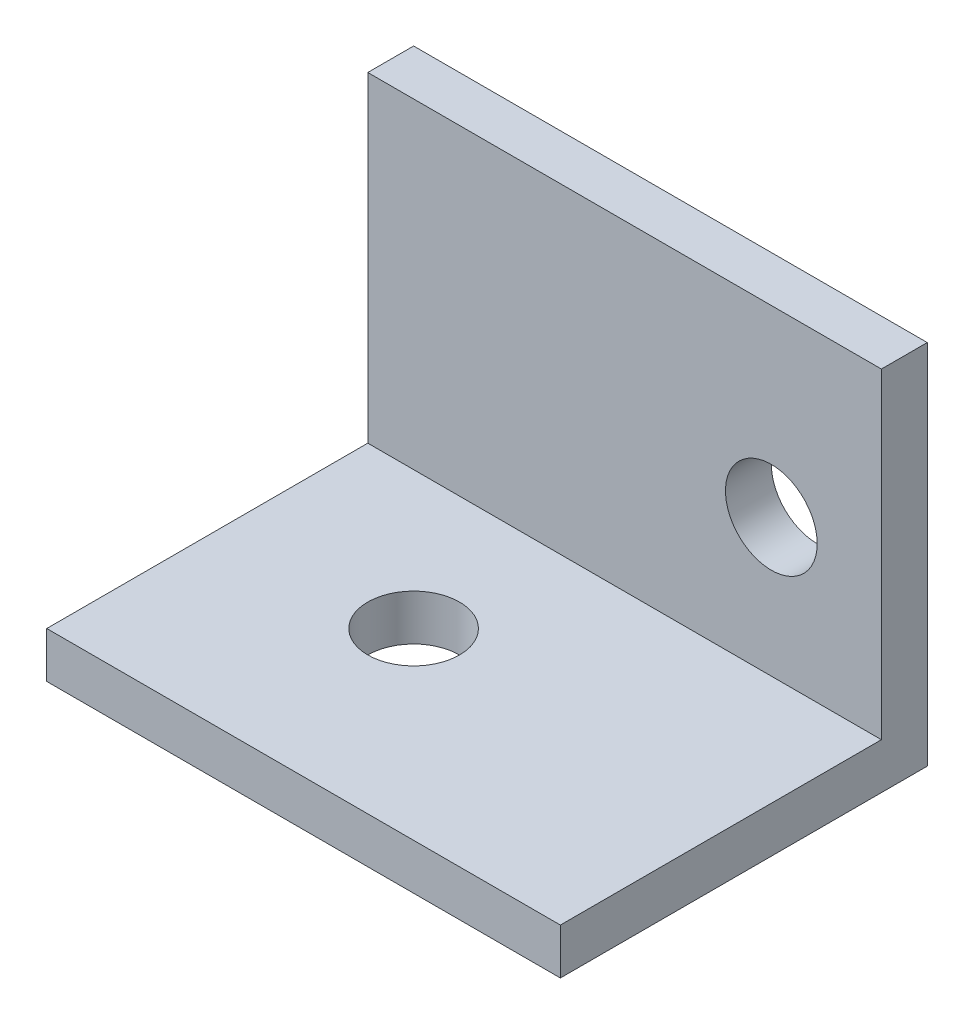
ISO-10303-21;
HEADER;
FILE_DESCRIPTION(('STEP AP214'),'2;1');
FILE_NAME('part.step','',(''),(''),'','','');
FILE_SCHEMA(('AUTOMOTIVE_DESIGN { 1 0 10303 214 1 1 1 1 }'));
ENDSEC;
DATA;
#1=APPLICATION_CONTEXT('core data for automotive mechanical design processes');
#2=APPLICATION_PROTOCOL_DEFINITION('international standard','automotive_design',2000,#1);
#3=PRODUCT_CONTEXT('',#1,'mechanical');
#4=PRODUCT('Part','Part','',(#3));
#5=PRODUCT_RELATED_PRODUCT_CATEGORY('part','',(#4));
#6=PRODUCT_DEFINITION_FORMATION('','',#4);
#7=PRODUCT_DEFINITION_CONTEXT('part definition',#1,'design');
#8=PRODUCT_DEFINITION('design','',#6,#7);
#9=PRODUCT_DEFINITION_SHAPE('','',#8);
#10=(LENGTH_UNIT() NAMED_UNIT(*) SI_UNIT(.MILLI.,.METRE.));
#11=(NAMED_UNIT(*) PLANE_ANGLE_UNIT() SI_UNIT($,.RADIAN.));
#12=(NAMED_UNIT(*) SI_UNIT($,.STERADIAN.) SOLID_ANGLE_UNIT());
#13=UNCERTAINTY_MEASURE_WITH_UNIT(LENGTH_MEASURE(1.E-05),#10,'distance_accuracy_value','');
#14=(GEOMETRIC_REPRESENTATION_CONTEXT(3) GLOBAL_UNCERTAINTY_ASSIGNED_CONTEXT((#13)) GLOBAL_UNIT_ASSIGNED_CONTEXT((#10,
#11,#12)) REPRESENTATION_CONTEXT('',''));
#15=CARTESIAN_POINT('',(0.,0.,0.));
#16=DIRECTION('',(0.,0.,1.));
#17=DIRECTION('',(1.,0.,0.));
#18=AXIS2_PLACEMENT_3D('',#15,#16,#17);
#19=CARTESIAN_POINT('',(0.,3.175,0.));
#20=DIRECTION('',(0.,-1.,0.));
#21=DIRECTION('',(0.,0.,-1.));
#22=AXIS2_PLACEMENT_3D('',#19,#20,#21);
#23=PLANE('',#22);
#24=CARTESIAN_POINT('',(-5.08,3.175,0.));
#25=DIRECTION('',(0.,1.,0.));
#26=DIRECTION('',(0.,0.,1.));
#27=AXIS2_PLACEMENT_3D('',#24,#25,#26);
#28=CIRCLE('',#27,3.175);
#29=CARTESIAN_POINT('',(-5.08,3.175,3.175));
#30=VERTEX_POINT('',#29);
#31=EDGE_CURVE('E150',#30,#30,#28,.T.);
#32=ORIENTED_EDGE('',*,*,#31,.F.);
#33=EDGE_LOOP('',(#32));
#34=FACE_BOUND('',#33,.T.);
#35=DIRECTION('',(1.,0.,0.));
#36=VECTOR('',#35,1.);
#37=CARTESIAN_POINT('',(-17.78,3.175,-9.525));
#38=LINE('',#37,#36);
#39=CARTESIAN_POINT('',(-17.78,3.175,-9.525));
#40=VERTEX_POINT('',#39);
#41=CARTESIAN_POINT('',(17.78,3.175,-9.525));
#42=VERTEX_POINT('',#41);
#43=EDGE_CURVE('E54',#40,#42,#38,.T.);
#44=ORIENTED_EDGE('',*,*,#43,.F.);
#45=DIRECTION('',(0.,0.,1.));
#46=VECTOR('',#45,1.);
#47=CARTESIAN_POINT('',(-17.78,3.175,12.7));
#48=LINE('',#47,#46);
#49=CARTESIAN_POINT('',(-17.78,3.175,12.7));
#50=VERTEX_POINT('',#49);
#51=EDGE_CURVE('E140',#40,#50,#48,.T.);
#52=ORIENTED_EDGE('',*,*,#51,.T.);
#53=DIRECTION('',(1.,0.,0.));
#54=VECTOR('',#53,1.);
#55=CARTESIAN_POINT('',(-17.78,3.175,12.7));
#56=LINE('',#55,#54);
#57=CARTESIAN_POINT('',(17.78,3.175,12.7));
#58=VERTEX_POINT('',#57);
#59=EDGE_CURVE('E60',#50,#58,#56,.T.);
#60=ORIENTED_EDGE('',*,*,#59,.T.);
#61=DIRECTION('',(0.,0.,-1.));
#62=VECTOR('',#61,1.);
#63=CARTESIAN_POINT('',(17.78,3.175,12.7));
#64=LINE('',#63,#62);
#65=EDGE_CURVE('E89',#58,#42,#64,.T.);
#66=ORIENTED_EDGE('',*,*,#65,.T.);
#67=EDGE_LOOP('',(#44,#52,#60,#66));
#68=FACE_BOUND('',#67,.T.);
#69=ADVANCED_FACE('F39',(#34,#68),#23,.F.);
#70=CARTESIAN_POINT('',(17.78,3.175,12.7));
#71=DIRECTION('',(-1.,0.,0.));
#72=DIRECTION('',(0.,0.,1.));
#73=AXIS2_PLACEMENT_3D('',#70,#71,#72);
#74=PLANE('',#73);
#75=DIRECTION('',(0.,0.,-1.));
#76=VECTOR('',#75,1.);
#77=CARTESIAN_POINT('',(17.78,0.,12.7));
#78=LINE('',#77,#76);
#79=CARTESIAN_POINT('',(17.78,0.,12.7));
#80=VERTEX_POINT('',#79);
#81=CARTESIAN_POINT('',(17.78,0.,-12.7));
#82=VERTEX_POINT('',#81);
#83=EDGE_CURVE('E95',#80,#82,#78,.T.);
#84=ORIENTED_EDGE('',*,*,#83,.T.);
#85=DIRECTION('',(0.,-1.,0.));
#86=VECTOR('',#85,1.);
#87=CARTESIAN_POINT('',(17.78,3.175,-12.7));
#88=LINE('',#87,#86);
#89=CARTESIAN_POINT('',(17.78,25.4,-12.7));
#90=VERTEX_POINT('',#89);
#91=EDGE_CURVE('E11',#90,#82,#88,.T.);
#92=ORIENTED_EDGE('',*,*,#91,.F.);
#93=DIRECTION('',(0.,0.,-1.));
#94=VECTOR('',#93,1.);
#95=CARTESIAN_POINT('',(17.78,25.4,-12.7));
#96=LINE('',#95,#94);
#97=CARTESIAN_POINT('',(17.78,25.4,-9.525));
#98=VERTEX_POINT('',#97);
#99=EDGE_CURVE('E131',#98,#90,#96,.T.);
#100=ORIENTED_EDGE('',*,*,#99,.F.);
#101=DIRECTION('',(0.,-1.,0.));
#102=VECTOR('',#101,1.);
#103=CARTESIAN_POINT('',(17.78,25.4,-9.525));
#104=LINE('',#103,#102);
#105=EDGE_CURVE('E104',#98,#42,#104,.T.);
#106=ORIENTED_EDGE('',*,*,#105,.T.);
#107=ORIENTED_EDGE('',*,*,#65,.F.);
#108=DIRECTION('',(0.,-1.,0.));
#109=VECTOR('',#108,1.);
#110=CARTESIAN_POINT('',(17.78,3.175,12.7));
#111=LINE('',#110,#109);
#112=EDGE_CURVE('E82',#58,#80,#111,.T.);
#113=ORIENTED_EDGE('',*,*,#112,.T.);
#114=EDGE_LOOP('',(#84,#92,#100,#106,#107,#113));
#115=FACE_BOUND('',#114,.T.);
#116=ADVANCED_FACE('F41',(#115),#74,.F.);
#117=CARTESIAN_POINT('',(-17.78,3.175,-12.7));
#118=DIRECTION('',(0.,0.,1.));
#119=DIRECTION('',(1.,0.,0.));
#120=AXIS2_PLACEMENT_3D('',#117,#118,#119);
#121=PLANE('',#120);
#122=CARTESIAN_POINT('',(10.16,12.7,-12.7));
#123=DIRECTION('',(0.,0.,1.));
#124=DIRECTION('',(1.,0.,0.));
#125=AXIS2_PLACEMENT_3D('',#122,#123,#124);
#126=CIRCLE('',#125,3.175);
#127=CARTESIAN_POINT('',(13.335,12.7,-12.7));
#128=VERTEX_POINT('',#127);
#129=EDGE_CURVE('E153',#128,#128,#126,.T.);
#130=ORIENTED_EDGE('',*,*,#129,.T.);
#131=EDGE_LOOP('',(#130));
#132=FACE_BOUND('',#131,.T.);
#133=DIRECTION('',(-1.,0.,0.));
#134=VECTOR('',#133,1.);
#135=CARTESIAN_POINT('',(-17.78,0.,-12.7));
#136=LINE('',#135,#134);
#137=CARTESIAN_POINT('',(-17.78,0.,-12.7));
#138=VERTEX_POINT('',#137);
#139=EDGE_CURVE('E99',#82,#138,#136,.T.);
#140=ORIENTED_EDGE('',*,*,#139,.T.);
#141=DIRECTION('',(0.,-1.,0.));
#142=VECTOR('',#141,1.);
#143=CARTESIAN_POINT('',(-17.78,3.175,-12.7));
#144=LINE('',#143,#142);
#145=CARTESIAN_POINT('',(-17.78,25.4,-12.7));
#146=VERTEX_POINT('',#145);
#147=EDGE_CURVE('E47',#146,#138,#144,.T.);
#148=ORIENTED_EDGE('',*,*,#147,.F.);
#149=DIRECTION('',(-1.,0.,0.));
#150=VECTOR('',#149,1.);
#151=CARTESIAN_POINT('',(-17.78,25.4,-12.7));
#152=LINE('',#151,#150);
#153=EDGE_CURVE('E123',#90,#146,#152,.T.);
#154=ORIENTED_EDGE('',*,*,#153,.F.);
#155=ORIENTED_EDGE('',*,*,#91,.T.);
#156=EDGE_LOOP('',(#140,#148,#154,#155));
#157=FACE_BOUND('',#156,.T.);
#158=ADVANCED_FACE('F121',(#132,#157),#121,.F.);
#159=CARTESIAN_POINT('',(-17.78,3.175,12.7));
#160=DIRECTION('',(1.,0.,0.));
#161=DIRECTION('',(0.,0.,-1.));
#162=AXIS2_PLACEMENT_3D('',#159,#160,#161);
#163=PLANE('',#162);
#164=DIRECTION('',(0.,0.,1.));
#165=VECTOR('',#164,1.);
#166=CARTESIAN_POINT('',(-17.78,0.,12.7));
#167=LINE('',#166,#165);
#168=CARTESIAN_POINT('',(-17.78,0.,12.7));
#169=VERTEX_POINT('',#168);
#170=EDGE_CURVE('E90',#138,#169,#167,.T.);
#171=ORIENTED_EDGE('',*,*,#170,.T.);
#172=DIRECTION('',(0.,-1.,0.));
#173=VECTOR('',#172,1.);
#174=CARTESIAN_POINT('',(-17.78,3.175,12.7));
#175=LINE('',#174,#173);
#176=EDGE_CURVE('E85',#50,#169,#175,.T.);
#177=ORIENTED_EDGE('',*,*,#176,.F.);
#178=ORIENTED_EDGE('',*,*,#51,.F.);
#179=DIRECTION('',(0.,-1.,0.));
#180=VECTOR('',#179,1.);
#181=CARTESIAN_POINT('',(-17.78,25.4,-9.525));
#182=LINE('',#181,#180);
#183=CARTESIAN_POINT('',(-17.78,25.4,-9.525));
#184=VERTEX_POINT('',#183);
#185=EDGE_CURVE('E100',#184,#40,#182,.T.);
#186=ORIENTED_EDGE('',*,*,#185,.F.);
#187=DIRECTION('',(0.,0.,1.));
#188=VECTOR('',#187,1.);
#189=CARTESIAN_POINT('',(-17.78,25.4,-12.7));
#190=LINE('',#189,#188);
#191=EDGE_CURVE('E117',#146,#184,#190,.T.);
#192=ORIENTED_EDGE('',*,*,#191,.F.);
#193=ORIENTED_EDGE('',*,*,#147,.T.);
#194=EDGE_LOOP('',(#171,#177,#178,#186,#192,#193));
#195=FACE_BOUND('',#194,.T.);
#196=ADVANCED_FACE('F114',(#195),#163,.F.);
#197=CARTESIAN_POINT('',(-17.78,3.175,12.7));
#198=DIRECTION('',(0.,0.,-1.));
#199=DIRECTION('',(-1.,0.,0.));
#200=AXIS2_PLACEMENT_3D('',#197,#198,#199);
#201=PLANE('',#200);
#202=DIRECTION('',(1.,0.,0.));
#203=VECTOR('',#202,1.);
#204=CARTESIAN_POINT('',(-17.78,0.,12.7));
#205=LINE('',#204,#203);
#206=EDGE_CURVE('E79',#169,#80,#205,.T.);
#207=ORIENTED_EDGE('',*,*,#206,.T.);
#208=ORIENTED_EDGE('',*,*,#112,.F.);
#209=ORIENTED_EDGE('',*,*,#59,.F.);
#210=ORIENTED_EDGE('',*,*,#176,.T.);
#211=EDGE_LOOP('',(#207,#208,#209,#210));
#212=FACE_BOUND('',#211,.T.);
#213=ADVANCED_FACE('F81',(#212),#201,.F.);
#214=CARTESIAN_POINT('',(0.,0.,0.));
#215=DIRECTION('',(0.,-1.,0.));
#216=DIRECTION('',(0.,0.,-1.));
#217=AXIS2_PLACEMENT_3D('',#214,#215,#216);
#218=PLANE('',#217);
#219=CARTESIAN_POINT('',(-5.08,0.,0.));
#220=DIRECTION('',(0.,1.,0.));
#221=DIRECTION('',(0.,0.,1.));
#222=AXIS2_PLACEMENT_3D('',#219,#220,#221);
#223=CIRCLE('',#222,3.175);
#224=CARTESIAN_POINT('',(-5.08,0.,3.175));
#225=VERTEX_POINT('',#224);
#226=EDGE_CURVE('E138',#225,#225,#223,.T.);
#227=ORIENTED_EDGE('',*,*,#226,.T.);
#228=EDGE_LOOP('',(#227));
#229=FACE_BOUND('',#228,.T.);
#230=ORIENTED_EDGE('',*,*,#83,.F.);
#231=ORIENTED_EDGE('',*,*,#206,.F.);
#232=ORIENTED_EDGE('',*,*,#170,.F.);
#233=ORIENTED_EDGE('',*,*,#139,.F.);
#234=EDGE_LOOP('',(#230,#231,#232,#233));
#235=FACE_BOUND('',#234,.T.);
#236=ADVANCED_FACE('F98',(#229,#235),#218,.T.);
#237=CARTESIAN_POINT('',(-17.78,25.4,-9.525));
#238=DIRECTION('',(0.,0.,-1.));
#239=DIRECTION('',(-1.,0.,0.));
#240=AXIS2_PLACEMENT_3D('',#237,#238,#239);
#241=PLANE('',#240);
#242=CARTESIAN_POINT('',(10.16,12.7,-9.525));
#243=DIRECTION('',(0.,0.,1.));
#244=DIRECTION('',(1.,0.,0.));
#245=AXIS2_PLACEMENT_3D('',#242,#243,#244);
#246=CIRCLE('',#245,3.175);
#247=CARTESIAN_POINT('',(13.335,12.7,-9.525));
#248=VERTEX_POINT('',#247);
#249=EDGE_CURVE('E156',#248,#248,#246,.T.);
#250=ORIENTED_EDGE('',*,*,#249,.F.);
#251=EDGE_LOOP('',(#250));
#252=FACE_BOUND('',#251,.T.);
#253=ORIENTED_EDGE('',*,*,#43,.T.);
#254=ORIENTED_EDGE('',*,*,#105,.F.);
#255=DIRECTION('',(1.,0.,0.));
#256=VECTOR('',#255,1.);
#257=CARTESIAN_POINT('',(-17.78,25.4,-9.525));
#258=LINE('',#257,#256);
#259=EDGE_CURVE('E134',#184,#98,#258,.T.);
#260=ORIENTED_EDGE('',*,*,#259,.F.);
#261=ORIENTED_EDGE('',*,*,#185,.T.);
#262=EDGE_LOOP('',(#253,#254,#260,#261));
#263=FACE_BOUND('',#262,.T.);
#264=ADVANCED_FACE('F143',(#252,#263),#241,.F.);
#265=CARTESIAN_POINT('',(0.,25.4,0.));
#266=DIRECTION('',(0.,1.,0.));
#267=DIRECTION('',(0.,0.,1.));
#268=AXIS2_PLACEMENT_3D('',#265,#266,#267);
#269=PLANE('',#268);
#270=ORIENTED_EDGE('',*,*,#191,.T.);
#271=ORIENTED_EDGE('',*,*,#259,.T.);
#272=ORIENTED_EDGE('',*,*,#99,.T.);
#273=ORIENTED_EDGE('',*,*,#153,.T.);
#274=EDGE_LOOP('',(#270,#271,#272,#273));
#275=FACE_BOUND('',#274,.T.);
#276=ADVANCED_FACE('F127',(#275),#269,.T.);
#277=CARTESIAN_POINT('',(-5.08,0.,0.));
#278=DIRECTION('',(0.,1.,0.));
#279=DIRECTION('',(0.,0.,1.));
#280=AXIS2_PLACEMENT_3D('',#277,#278,#279);
#281=CYLINDRICAL_SURFACE('',#280,3.175);
#282=ORIENTED_EDGE('',*,*,#226,.F.);
#283=EDGE_LOOP('',(#282));
#284=FACE_BOUND('',#283,.T.);
#285=ORIENTED_EDGE('',*,*,#31,.T.);
#286=EDGE_LOOP('',(#285));
#287=FACE_BOUND('',#286,.T.);
#288=ADVANCED_FACE('F166',(#284,#287),#281,.F.);
#289=CARTESIAN_POINT('',(10.16,12.7,-12.7));
#290=DIRECTION('',(0.,0.,1.));
#291=DIRECTION('',(1.,0.,0.));
#292=AXIS2_PLACEMENT_3D('',#289,#290,#291);
#293=CYLINDRICAL_SURFACE('',#292,3.175);
#294=ORIENTED_EDGE('',*,*,#129,.F.);
#295=EDGE_LOOP('',(#294));
#296=FACE_BOUND('',#295,.T.);
#297=ORIENTED_EDGE('',*,*,#249,.T.);
#298=EDGE_LOOP('',(#297));
#299=FACE_BOUND('',#298,.T.);
#300=ADVANCED_FACE('F163',(#296,#299),#293,.F.);
#301=CLOSED_SHELL('',(#69,#116,#158,#196,#213,#236,#264,#276,#288,#300));
#302=MANIFOLD_SOLID_BREP('B2',#301);
#303=ADVANCED_BREP_SHAPE_REPRESENTATION('',(#18,#302),#14);
#304=SHAPE_DEFINITION_REPRESENTATION(#9,#303);
ENDSEC;
END-ISO-10303-21;
